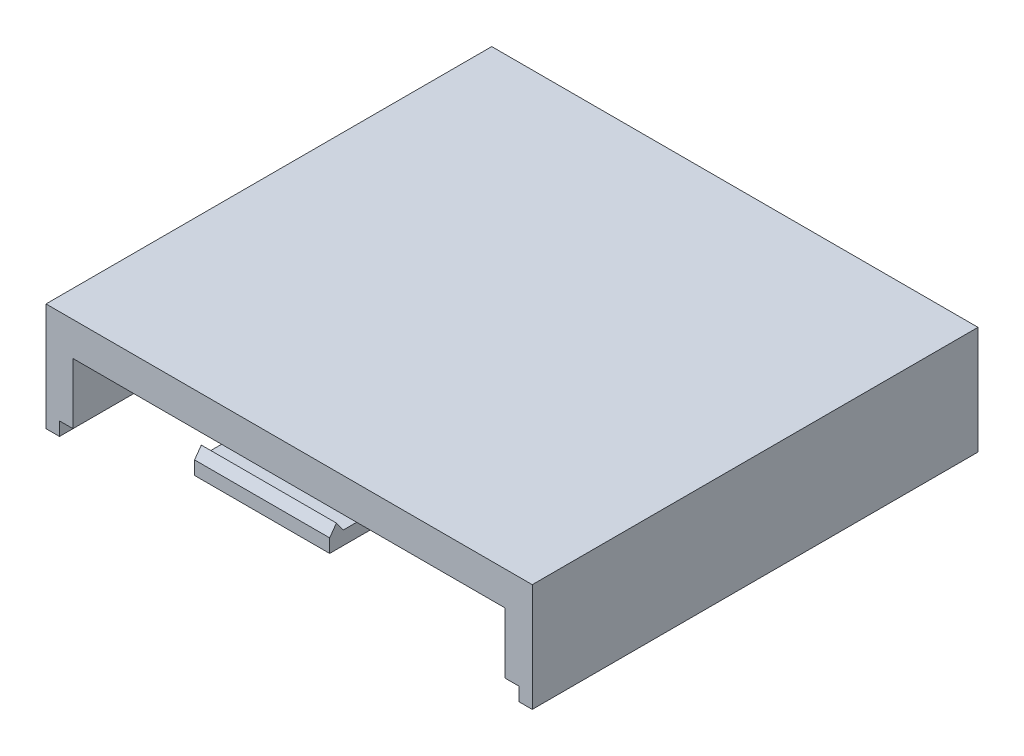
ISO-10303-21;
HEADER;
FILE_DESCRIPTION(('STEP AP214'),'2;1');
FILE_NAME('part.step','',(''),(''),'','','');
FILE_SCHEMA(('AUTOMOTIVE_DESIGN { 1 0 10303 214 1 1 1 1 }'));
ENDSEC;
DATA;
#1=APPLICATION_CONTEXT('core data for automotive mechanical design processes');
#2=APPLICATION_PROTOCOL_DEFINITION('international standard','automotive_design',2000,#1);
#3=PRODUCT_CONTEXT('',#1,'mechanical');
#4=PRODUCT('Part','Part','',(#3));
#5=PRODUCT_RELATED_PRODUCT_CATEGORY('part','',(#4));
#6=PRODUCT_DEFINITION_FORMATION('','',#4);
#7=PRODUCT_DEFINITION_CONTEXT('part definition',#1,'design');
#8=PRODUCT_DEFINITION('design','',#6,#7);
#9=PRODUCT_DEFINITION_SHAPE('','',#8);
#10=(LENGTH_UNIT() NAMED_UNIT(*) SI_UNIT(.MILLI.,.METRE.));
#11=(NAMED_UNIT(*) PLANE_ANGLE_UNIT() SI_UNIT($,.RADIAN.));
#12=(NAMED_UNIT(*) SI_UNIT($,.STERADIAN.) SOLID_ANGLE_UNIT());
#13=UNCERTAINTY_MEASURE_WITH_UNIT(LENGTH_MEASURE(1.E-05),#10,'distance_accuracy_value','');
#14=(GEOMETRIC_REPRESENTATION_CONTEXT(3) GLOBAL_UNCERTAINTY_ASSIGNED_CONTEXT((#13)) GLOBAL_UNIT_ASSIGNED_CONTEXT((#10,
#11,#12)) REPRESENTATION_CONTEXT('',''));
#15=CARTESIAN_POINT('',(0.,0.,0.));
#16=DIRECTION('',(0.,0.,1.));
#17=DIRECTION('',(1.,0.,0.));
#18=AXIS2_PLACEMENT_3D('',#15,#16,#17);
#19=CARTESIAN_POINT('',(17.,-5.50000000000001,33.));
#20=DIRECTION('',(0.,1.,0.));
#21=DIRECTION('',(0.,0.,1.));
#22=AXIS2_PLACEMENT_3D('',#19,#20,#21);
#23=PLANE('',#22);
#24=DIRECTION('',(0.,0.,-1.));
#25=VECTOR('',#24,1.);
#26=CARTESIAN_POINT('',(3.5,-5.50000000000001,1.2));
#27=LINE('',#26,#25);
#28=CARTESIAN_POINT('',(3.5,-5.50000000000001,1.2));
#29=VERTEX_POINT('',#28);
#30=CARTESIAN_POINT('',(3.5,-5.50000000000001,0.));
#31=VERTEX_POINT('',#30);
#32=EDGE_CURVE('E316',#29,#31,#27,.T.);
#33=ORIENTED_EDGE('',*,*,#32,.F.);
#34=DIRECTION('',(1.,0.,0.));
#35=VECTOR('',#34,1.);
#36=CARTESIAN_POINT('',(17.,-5.50000000000001,1.2));
#37=LINE('',#36,#35);
#38=CARTESIAN_POINT('',(-3.5,-5.50000000000001,1.2));
#39=VERTEX_POINT('',#38);
#40=EDGE_CURVE('E345',#39,#29,#37,.T.);
#41=ORIENTED_EDGE('',*,*,#40,.F.);
#42=DIRECTION('',(0.,0.,-1.));
#43=VECTOR('',#42,1.);
#44=CARTESIAN_POINT('',(-3.5,-5.50000000000001,1.2));
#45=LINE('',#44,#43);
#46=CARTESIAN_POINT('',(-3.5,-5.50000000000001,0.));
#47=VERTEX_POINT('',#46);
#48=EDGE_CURVE('E307',#39,#47,#45,.T.);
#49=ORIENTED_EDGE('',*,*,#48,.T.);
#50=DIRECTION('',(1.,0.,0.));
#51=VECTOR('',#50,1.);
#52=CARTESIAN_POINT('',(17.,-5.50000000000001,0.));
#53=LINE('',#52,#51);
#54=EDGE_CURVE('E383',#47,#31,#53,.T.);
#55=ORIENTED_EDGE('',*,*,#54,.T.);
#56=EDGE_LOOP('',(#33,#41,#49,#55));
#57=FACE_BOUND('',#56,.T.);
#58=ADVANCED_FACE('F33',(#57),#23,.F.);
#59=DIRECTION('',(0.,0.,-1.));
#60=VECTOR('',#59,1.);
#61=CARTESIAN_POINT('',(-5.,-5.50000000000001,1.2));
#62=LINE('',#61,#60);
#63=CARTESIAN_POINT('',(-5.,-5.50000000000001,1.2));
#64=VERTEX_POINT('',#63);
#65=CARTESIAN_POINT('',(-5.,-5.50000000000001,0.));
#66=VERTEX_POINT('',#65);
#67=EDGE_CURVE('E305',#64,#66,#62,.T.);
#68=ORIENTED_EDGE('',*,*,#67,.F.);
#69=CARTESIAN_POINT('',(-17.,-5.50000000000001,1.2));
#70=VERTEX_POINT('',#69);
#71=EDGE_CURVE('E341',#70,#64,#37,.T.);
#72=ORIENTED_EDGE('',*,*,#71,.F.);
#73=DIRECTION('',(0.,0.,-1.));
#74=VECTOR('',#73,1.);
#75=CARTESIAN_POINT('',(-17.,-5.50000000000001,33.));
#76=LINE('',#75,#74);
#77=CARTESIAN_POINT('',(-17.,-5.50000000000001,33.));
#78=VERTEX_POINT('',#77);
#79=EDGE_CURVE('E41',#78,#70,#76,.T.);
#80=ORIENTED_EDGE('',*,*,#79,.F.);
#81=DIRECTION('',(1.,0.,0.));
#82=VECTOR('',#81,1.);
#83=CARTESIAN_POINT('',(-18.,-5.50000000000001,33.));
#84=LINE('',#83,#82);
#85=CARTESIAN_POINT('',(-18.,-5.50000000000001,33.));
#86=VERTEX_POINT('',#85);
#87=EDGE_CURVE('E349',#86,#78,#84,.T.);
#88=ORIENTED_EDGE('',*,*,#87,.F.);
#89=DIRECTION('',(0.,0.,-1.));
#90=VECTOR('',#89,1.);
#91=CARTESIAN_POINT('',(-18.,-5.50000000000001,33.));
#92=LINE('',#91,#90);
#93=CARTESIAN_POINT('',(-18.,-5.50000000000001,0.));
#94=VERTEX_POINT('',#93);
#95=EDGE_CURVE('E11',#86,#94,#92,.T.);
#96=ORIENTED_EDGE('',*,*,#95,.T.);
#97=EDGE_CURVE('E379',#94,#66,#53,.T.);
#98=ORIENTED_EDGE('',*,*,#97,.T.);
#99=EDGE_LOOP('',(#68,#72,#80,#88,#96,#98));
#100=FACE_BOUND('',#99,.T.);
#101=ADVANCED_FACE('F424',(#100),#23,.F.);
#102=DIRECTION('',(0.,0.,-1.));
#103=VECTOR('',#102,1.);
#104=CARTESIAN_POINT('',(5.,-5.50000000000001,1.2));
#105=LINE('',#104,#103);
#106=CARTESIAN_POINT('',(5.,-5.50000000000001,1.2));
#107=VERTEX_POINT('',#106);
#108=CARTESIAN_POINT('',(5.,-5.50000000000001,0.));
#109=VERTEX_POINT('',#108);
#110=EDGE_CURVE('E56',#107,#109,#105,.T.);
#111=ORIENTED_EDGE('',*,*,#110,.T.);
#112=CARTESIAN_POINT('',(18.,-5.50000000000001,0.));
#113=VERTEX_POINT('',#112);
#114=EDGE_CURVE('E378',#109,#113,#53,.T.);
#115=ORIENTED_EDGE('',*,*,#114,.T.);
#116=DIRECTION('',(0.,0.,-1.));
#117=VECTOR('',#116,1.);
#118=CARTESIAN_POINT('',(18.,-5.50000000000001,33.));
#119=LINE('',#118,#117);
#120=CARTESIAN_POINT('',(18.,-5.50000000000001,33.));
#121=VERTEX_POINT('',#120);
#122=EDGE_CURVE('E391',#121,#113,#119,.T.);
#123=ORIENTED_EDGE('',*,*,#122,.F.);
#124=DIRECTION('',(1.,0.,0.));
#125=VECTOR('',#124,1.);
#126=CARTESIAN_POINT('',(17.,-5.50000000000001,33.));
#127=LINE('',#126,#125);
#128=CARTESIAN_POINT('',(17.,-5.50000000000001,33.));
#129=VERTEX_POINT('',#128);
#130=EDGE_CURVE('E369',#129,#121,#127,.T.);
#131=ORIENTED_EDGE('',*,*,#130,.F.);
#132=DIRECTION('',(0.,0.,-1.));
#133=VECTOR('',#132,1.);
#134=CARTESIAN_POINT('',(17.,-5.50000000000001,33.));
#135=LINE('',#134,#133);
#136=CARTESIAN_POINT('',(17.,-5.50000000000001,1.2));
#137=VERTEX_POINT('',#136);
#138=EDGE_CURVE('E394',#129,#137,#135,.T.);
#139=ORIENTED_EDGE('',*,*,#138,.T.);
#140=EDGE_CURVE('E340',#107,#137,#37,.T.);
#141=ORIENTED_EDGE('',*,*,#140,.F.);
#142=EDGE_LOOP('',(#111,#115,#123,#131,#139,#141));
#143=FACE_BOUND('',#142,.T.);
#144=ADVANCED_FACE('F443',(#143),#23,.F.);
#145=CARTESIAN_POINT('',(-17.,-5.50000000000001,33.));
#146=DIRECTION('',(-1.,0.,0.));
#147=DIRECTION('',(0.,0.,1.));
#148=AXIS2_PLACEMENT_3D('',#145,#146,#147);
#149=PLANE('',#148);
#150=DIRECTION('',(0.,-1.,0.));
#151=VECTOR('',#150,1.);
#152=CARTESIAN_POINT('',(-17.,-5.50000000000001,1.2));
#153=LINE('',#152,#151);
#154=CARTESIAN_POINT('',(-17.,-4.5,1.2));
#155=VERTEX_POINT('',#154);
#156=EDGE_CURVE('E337',#155,#70,#153,.T.);
#157=ORIENTED_EDGE('',*,*,#156,.F.);
#158=DIRECTION('',(0.,0.,-1.));
#159=VECTOR('',#158,1.);
#160=CARTESIAN_POINT('',(-17.,-4.5,33.));
#161=LINE('',#160,#159);
#162=CARTESIAN_POINT('',(-17.,-4.5,33.));
#163=VERTEX_POINT('',#162);
#164=EDGE_CURVE('E412',#163,#155,#161,.T.);
#165=ORIENTED_EDGE('',*,*,#164,.F.);
#166=DIRECTION('',(0.,1.,0.));
#167=VECTOR('',#166,1.);
#168=CARTESIAN_POINT('',(-17.,-5.50000000000001,33.));
#169=LINE('',#168,#167);
#170=EDGE_CURVE('E352',#78,#163,#169,.T.);
#171=ORIENTED_EDGE('',*,*,#170,.F.);
#172=ORIENTED_EDGE('',*,*,#79,.T.);
#173=EDGE_LOOP('',(#157,#165,#171,#172));
#174=FACE_BOUND('',#173,.T.);
#175=ADVANCED_FACE('F417',(#174),#149,.F.);
#176=CARTESIAN_POINT('',(-17.,-4.5,33.));
#177=DIRECTION('',(0.,1.,0.));
#178=DIRECTION('',(0.,0.,1.));
#179=AXIS2_PLACEMENT_3D('',#176,#177,#178);
#180=PLANE('',#179);
#181=DIRECTION('',(-1.,0.,0.));
#182=VECTOR('',#181,1.);
#183=CARTESIAN_POINT('',(-17.,-4.5,1.2));
#184=LINE('',#183,#182);
#185=CARTESIAN_POINT('',(-16.,-4.5,1.2));
#186=VERTEX_POINT('',#185);
#187=EDGE_CURVE('E334',#186,#155,#184,.T.);
#188=ORIENTED_EDGE('',*,*,#187,.F.);
#189=DIRECTION('',(0.,0.,-1.));
#190=VECTOR('',#189,1.);
#191=CARTESIAN_POINT('',(-16.,-4.5,33.));
#192=LINE('',#191,#190);
#193=CARTESIAN_POINT('',(-16.,-4.5,33.));
#194=VERTEX_POINT('',#193);
#195=EDGE_CURVE('E409',#194,#186,#192,.T.);
#196=ORIENTED_EDGE('',*,*,#195,.F.);
#197=DIRECTION('',(1.,0.,0.));
#198=VECTOR('',#197,1.);
#199=CARTESIAN_POINT('',(-17.,-4.5,33.));
#200=LINE('',#199,#198);
#201=EDGE_CURVE('E354',#163,#194,#200,.T.);
#202=ORIENTED_EDGE('',*,*,#201,.F.);
#203=ORIENTED_EDGE('',*,*,#164,.T.);
#204=EDGE_LOOP('',(#188,#196,#202,#203));
#205=FACE_BOUND('',#204,.T.);
#206=ADVANCED_FACE('F506',(#205),#180,.F.);
#207=CARTESIAN_POINT('',(-16.,-4.5,33.));
#208=DIRECTION('',(-1.,0.,0.));
#209=DIRECTION('',(0.,0.,1.));
#210=AXIS2_PLACEMENT_3D('',#207,#208,#209);
#211=PLANE('',#210);
#212=DIRECTION('',(0.,-1.,0.));
#213=VECTOR('',#212,1.);
#214=CARTESIAN_POINT('',(-16.,-4.5,1.2));
#215=LINE('',#214,#213);
#216=CARTESIAN_POINT('',(-16.,0.,1.2));
#217=VERTEX_POINT('',#216);
#218=EDGE_CURVE('E331',#217,#186,#215,.T.);
#219=ORIENTED_EDGE('',*,*,#218,.F.);
#220=DIRECTION('',(0.,0.,-1.));
#221=VECTOR('',#220,1.);
#222=CARTESIAN_POINT('',(-16.,0.,33.));
#223=LINE('',#222,#221);
#224=CARTESIAN_POINT('',(-16.,0.,33.));
#225=VERTEX_POINT('',#224);
#226=EDGE_CURVE('E406',#225,#217,#223,.T.);
#227=ORIENTED_EDGE('',*,*,#226,.F.);
#228=DIRECTION('',(0.,1.,0.));
#229=VECTOR('',#228,1.);
#230=CARTESIAN_POINT('',(-16.,-4.5,33.));
#231=LINE('',#230,#229);
#232=EDGE_CURVE('E356',#194,#225,#231,.T.);
#233=ORIENTED_EDGE('',*,*,#232,.F.);
#234=ORIENTED_EDGE('',*,*,#195,.T.);
#235=EDGE_LOOP('',(#219,#227,#233,#234));
#236=FACE_BOUND('',#235,.T.);
#237=ADVANCED_FACE('F501',(#236),#211,.F.);
#238=CARTESIAN_POINT('',(-16.,0.,33.));
#239=DIRECTION('',(0.,1.,0.));
#240=DIRECTION('',(-1.,0.,0.));
#241=AXIS2_PLACEMENT_3D('',#238,#239,#240);
#242=PLANE('',#241);
#243=DIRECTION('',(-1.,0.,0.));
#244=VECTOR('',#243,1.);
#245=CARTESIAN_POINT('',(-5.,0.,32.));
#246=LINE('',#245,#244);
#247=CARTESIAN_POINT('',(5.,0.,32.));
#248=VERTEX_POINT('',#247);
#249=CARTESIAN_POINT('',(-5.,0.,32.));
#250=VERTEX_POINT('',#249);
#251=EDGE_CURVE('E260',#248,#250,#246,.T.);
#252=ORIENTED_EDGE('',*,*,#251,.T.);
#253=DIRECTION('',(0.,0.,1.));
#254=VECTOR('',#253,1.);
#255=CARTESIAN_POINT('',(-5.,0.,32.));
#256=LINE('',#255,#254);
#257=CARTESIAN_POINT('',(-5.,0.,33.));
#258=VERTEX_POINT('',#257);
#259=EDGE_CURVE('E264',#250,#258,#256,.T.);
#260=ORIENTED_EDGE('',*,*,#259,.T.);
#261=DIRECTION('',(1.,0.,0.));
#262=VECTOR('',#261,1.);
#263=CARTESIAN_POINT('',(-16.,0.,33.));
#264=LINE('',#263,#262);
#265=EDGE_CURVE('E359',#225,#258,#264,.T.);
#266=ORIENTED_EDGE('',*,*,#265,.F.);
#267=ORIENTED_EDGE('',*,*,#226,.T.);
#268=DIRECTION('',(-1.,0.,0.));
#269=VECTOR('',#268,1.);
#270=CARTESIAN_POINT('',(-16.,0.,1.2));
#271=LINE('',#270,#269);
#272=CARTESIAN_POINT('',(16.,0.,1.2));
#273=VERTEX_POINT('',#272);
#274=EDGE_CURVE('E328',#273,#217,#271,.T.);
#275=ORIENTED_EDGE('',*,*,#274,.F.);
#276=DIRECTION('',(0.,0.,-1.));
#277=VECTOR('',#276,1.);
#278=CARTESIAN_POINT('',(16.,0.,33.));
#279=LINE('',#278,#277);
#280=CARTESIAN_POINT('',(16.,0.,33.));
#281=VERTEX_POINT('',#280);
#282=EDGE_CURVE('E403',#281,#273,#279,.T.);
#283=ORIENTED_EDGE('',*,*,#282,.F.);
#284=CARTESIAN_POINT('',(5.,0.,33.));
#285=VERTEX_POINT('',#284);
#286=EDGE_CURVE('E358',#285,#281,#264,.T.);
#287=ORIENTED_EDGE('',*,*,#286,.F.);
#288=DIRECTION('',(0.,0.,1.));
#289=VECTOR('',#288,1.);
#290=CARTESIAN_POINT('',(5.,0.,32.));
#291=LINE('',#290,#289);
#292=EDGE_CURVE('E48',#248,#285,#291,.T.);
#293=ORIENTED_EDGE('',*,*,#292,.F.);
#294=EDGE_LOOP('',(#252,#260,#266,#267,#275,#283,#287,#293));
#295=FACE_BOUND('',#294,.T.);
#296=ADVANCED_FACE('F496',(#295),#242,.F.);
#297=CARTESIAN_POINT('',(16.,0.,33.));
#298=DIRECTION('',(1.,0.,0.));
#299=DIRECTION('',(0.,1.,0.));
#300=AXIS2_PLACEMENT_3D('',#297,#298,#299);
#301=PLANE('',#300);
#302=DIRECTION('',(0.,1.,0.));
#303=VECTOR('',#302,1.);
#304=CARTESIAN_POINT('',(16.,0.,1.2));
#305=LINE('',#304,#303);
#306=CARTESIAN_POINT('',(16.,-4.5,1.2));
#307=VERTEX_POINT('',#306);
#308=EDGE_CURVE('E325',#307,#273,#305,.T.);
#309=ORIENTED_EDGE('',*,*,#308,.F.);
#310=DIRECTION('',(0.,0.,-1.));
#311=VECTOR('',#310,1.);
#312=CARTESIAN_POINT('',(16.,-4.5,33.));
#313=LINE('',#312,#311);
#314=CARTESIAN_POINT('',(16.,-4.5,33.));
#315=VERTEX_POINT('',#314);
#316=EDGE_CURVE('E400',#315,#307,#313,.T.);
#317=ORIENTED_EDGE('',*,*,#316,.F.);
#318=DIRECTION('',(0.,-1.,0.));
#319=VECTOR('',#318,1.);
#320=CARTESIAN_POINT('',(16.,0.,33.));
#321=LINE('',#320,#319);
#322=EDGE_CURVE('E362',#281,#315,#321,.T.);
#323=ORIENTED_EDGE('',*,*,#322,.F.);
#324=ORIENTED_EDGE('',*,*,#282,.T.);
#325=EDGE_LOOP('',(#309,#317,#323,#324));
#326=FACE_BOUND('',#325,.T.);
#327=ADVANCED_FACE('F492',(#326),#301,.F.);
#328=CARTESIAN_POINT('',(16.,-4.5,33.));
#329=DIRECTION('',(0.,1.,0.));
#330=DIRECTION('',(-1.,0.,0.));
#331=AXIS2_PLACEMENT_3D('',#328,#329,#330);
#332=PLANE('',#331);
#333=DIRECTION('',(-1.,0.,0.));
#334=VECTOR('',#333,1.);
#335=CARTESIAN_POINT('',(16.,-4.5,1.2));
#336=LINE('',#335,#334);
#337=CARTESIAN_POINT('',(17.,-4.5,1.2));
#338=VERTEX_POINT('',#337);
#339=EDGE_CURVE('E322',#338,#307,#336,.T.);
#340=ORIENTED_EDGE('',*,*,#339,.F.);
#341=DIRECTION('',(0.,0.,-1.));
#342=VECTOR('',#341,1.);
#343=CARTESIAN_POINT('',(17.,-4.5,33.));
#344=LINE('',#343,#342);
#345=CARTESIAN_POINT('',(17.,-4.5,33.));
#346=VERTEX_POINT('',#345);
#347=EDGE_CURVE('E397',#346,#338,#344,.T.);
#348=ORIENTED_EDGE('',*,*,#347,.F.);
#349=DIRECTION('',(1.,0.,0.));
#350=VECTOR('',#349,1.);
#351=CARTESIAN_POINT('',(16.,-4.5,33.));
#352=LINE('',#351,#350);
#353=EDGE_CURVE('E365',#315,#346,#352,.T.);
#354=ORIENTED_EDGE('',*,*,#353,.F.);
#355=ORIENTED_EDGE('',*,*,#316,.T.);
#356=EDGE_LOOP('',(#340,#348,#354,#355));
#357=FACE_BOUND('',#356,.T.);
#358=ADVANCED_FACE('F488',(#357),#332,.F.);
#359=CARTESIAN_POINT('',(17.,-4.5,33.));
#360=DIRECTION('',(1.,0.,0.));
#361=DIRECTION('',(0.,1.,0.));
#362=AXIS2_PLACEMENT_3D('',#359,#360,#361);
#363=PLANE('',#362);
#364=DIRECTION('',(0.,1.,0.));
#365=VECTOR('',#364,1.);
#366=CARTESIAN_POINT('',(17.,-4.5,1.2));
#367=LINE('',#366,#365);
#368=EDGE_CURVE('E319',#137,#338,#367,.T.);
#369=ORIENTED_EDGE('',*,*,#368,.F.);
#370=ORIENTED_EDGE('',*,*,#138,.F.);
#371=DIRECTION('',(0.,-1.,0.));
#372=VECTOR('',#371,1.);
#373=CARTESIAN_POINT('',(17.,-4.5,33.));
#374=LINE('',#373,#372);
#375=EDGE_CURVE('E367',#346,#129,#374,.T.);
#376=ORIENTED_EDGE('',*,*,#375,.F.);
#377=ORIENTED_EDGE('',*,*,#347,.T.);
#378=EDGE_LOOP('',(#369,#370,#376,#377));
#379=FACE_BOUND('',#378,.T.);
#380=ADVANCED_FACE('F486',(#379),#363,.F.);
#381=CARTESIAN_POINT('',(-18.,2.5,33.));
#382=DIRECTION('',(1.,0.,0.));
#383=DIRECTION('',(0.,0.,-1.));
#384=AXIS2_PLACEMENT_3D('',#381,#382,#383);
#385=PLANE('',#384);
#386=DIRECTION('',(0.,-1.,0.));
#387=VECTOR('',#386,1.);
#388=CARTESIAN_POINT('',(-18.,2.5,0.));
#389=LINE('',#388,#387);
#390=CARTESIAN_POINT('',(-18.,2.5,0.));
#391=VERTEX_POINT('',#390);
#392=EDGE_CURVE('E344',#391,#94,#389,.T.);
#393=ORIENTED_EDGE('',*,*,#392,.T.);
#394=ORIENTED_EDGE('',*,*,#95,.F.);
#395=DIRECTION('',(0.,-1.,0.));
#396=VECTOR('',#395,1.);
#397=CARTESIAN_POINT('',(-18.,2.5,33.));
#398=LINE('',#397,#396);
#399=CARTESIAN_POINT('',(-18.,2.5,33.));
#400=VERTEX_POINT('',#399);
#401=EDGE_CURVE('E346',#400,#86,#398,.T.);
#402=ORIENTED_EDGE('',*,*,#401,.F.);
#403=DIRECTION('',(0.,0.,-1.));
#404=VECTOR('',#403,1.);
#405=CARTESIAN_POINT('',(-18.,2.5,33.));
#406=LINE('',#405,#404);
#407=EDGE_CURVE('E375',#400,#391,#406,.T.);
#408=ORIENTED_EDGE('',*,*,#407,.T.);
#409=EDGE_LOOP('',(#393,#394,#402,#408));
#410=FACE_BOUND('',#409,.T.);
#411=ADVANCED_FACE('F35',(#410),#385,.F.);
#412=CARTESIAN_POINT('',(18.,-5.50000000000001,33.));
#413=DIRECTION('',(-1.,0.,0.));
#414=DIRECTION('',(0.,0.,1.));
#415=AXIS2_PLACEMENT_3D('',#412,#413,#414);
#416=PLANE('',#415);
#417=DIRECTION('',(0.,1.,0.));
#418=VECTOR('',#417,1.);
#419=CARTESIAN_POINT('',(18.,-5.50000000000001,0.));
#420=LINE('',#419,#418);
#421=CARTESIAN_POINT('',(18.,2.5,0.));
#422=VERTEX_POINT('',#421);
#423=EDGE_CURVE('E382',#113,#422,#420,.T.);
#424=ORIENTED_EDGE('',*,*,#423,.T.);
#425=DIRECTION('',(0.,0.,-1.));
#426=VECTOR('',#425,1.);
#427=CARTESIAN_POINT('',(18.,2.5,33.));
#428=LINE('',#427,#426);
#429=CARTESIAN_POINT('',(18.,2.5,33.));
#430=VERTEX_POINT('',#429);
#431=EDGE_CURVE('E388',#430,#422,#428,.T.);
#432=ORIENTED_EDGE('',*,*,#431,.F.);
#433=DIRECTION('',(0.,1.,0.));
#434=VECTOR('',#433,1.);
#435=CARTESIAN_POINT('',(18.,-5.50000000000001,33.));
#436=LINE('',#435,#434);
#437=EDGE_CURVE('E371',#121,#430,#436,.T.);
#438=ORIENTED_EDGE('',*,*,#437,.F.);
#439=ORIENTED_EDGE('',*,*,#122,.T.);
#440=EDGE_LOOP('',(#424,#432,#438,#439));
#441=FACE_BOUND('',#440,.T.);
#442=ADVANCED_FACE('F470',(#441),#416,.F.);
#443=CARTESIAN_POINT('',(18.,2.5,33.));
#444=DIRECTION('',(0.,-1.,0.));
#445=DIRECTION('',(0.,0.,-1.));
#446=AXIS2_PLACEMENT_3D('',#443,#444,#445);
#447=PLANE('',#446);
#448=DIRECTION('',(-1.,0.,0.));
#449=VECTOR('',#448,1.);
#450=CARTESIAN_POINT('',(18.,2.5,0.));
#451=LINE('',#450,#449);
#452=EDGE_CURVE('E350',#422,#391,#451,.T.);
#453=ORIENTED_EDGE('',*,*,#452,.T.);
#454=ORIENTED_EDGE('',*,*,#407,.F.);
#455=DIRECTION('',(-1.,0.,0.));
#456=VECTOR('',#455,1.);
#457=CARTESIAN_POINT('',(18.,2.5,33.));
#458=LINE('',#457,#456);
#459=EDGE_CURVE('E373',#430,#400,#458,.T.);
#460=ORIENTED_EDGE('',*,*,#459,.F.);
#461=ORIENTED_EDGE('',*,*,#431,.T.);
#462=EDGE_LOOP('',(#453,#454,#460,#461));
#463=FACE_BOUND('',#462,.T.);
#464=ADVANCED_FACE('F475',(#463),#447,.F.);
#465=CARTESIAN_POINT('',(0.,0.,33.));
#466=DIRECTION('',(0.,0.,1.));
#467=DIRECTION('',(1.,0.,0.));
#468=AXIS2_PLACEMENT_3D('',#465,#466,#467);
#469=PLANE('',#468);
#470=ORIENTED_EDGE('',*,*,#401,.T.);
#471=ORIENTED_EDGE('',*,*,#87,.T.);
#472=ORIENTED_EDGE('',*,*,#170,.T.);
#473=ORIENTED_EDGE('',*,*,#201,.T.);
#474=ORIENTED_EDGE('',*,*,#232,.T.);
#475=ORIENTED_EDGE('',*,*,#265,.T.);
#476=EDGE_CURVE('E363',#258,#285,#264,.T.);
#477=ORIENTED_EDGE('',*,*,#476,.T.);
#478=ORIENTED_EDGE('',*,*,#286,.T.);
#479=ORIENTED_EDGE('',*,*,#322,.T.);
#480=ORIENTED_EDGE('',*,*,#353,.T.);
#481=ORIENTED_EDGE('',*,*,#375,.T.);
#482=ORIENTED_EDGE('',*,*,#130,.T.);
#483=ORIENTED_EDGE('',*,*,#437,.T.);
#484=ORIENTED_EDGE('',*,*,#459,.T.);
#485=EDGE_LOOP('',(#470,#471,#472,#473,#474,#475,#477,#478,#479,#480,#481,#482,#483,#484));
#486=FACE_BOUND('',#485,.T.);
#487=ADVANCED_FACE('F481',(#486),#469,.T.);
#488=CARTESIAN_POINT('',(0.,0.,0.));
#489=DIRECTION('',(0.,0.,1.));
#490=DIRECTION('',(1.,0.,0.));
#491=AXIS2_PLACEMENT_3D('',#488,#489,#490);
#492=PLANE('',#491);
#493=DIRECTION('',(0.,-1.,0.));
#494=VECTOR('',#493,1.);
#495=CARTESIAN_POINT('',(3.5,-8.55000000000001,0.));
#496=LINE('',#495,#494);
#497=CARTESIAN_POINT('',(3.5,-8.55000000000001,0.));
#498=VERTEX_POINT('',#497);
#499=EDGE_CURVE('E267',#31,#498,#496,.T.);
#500=ORIENTED_EDGE('',*,*,#499,.F.);
#501=ORIENTED_EDGE('',*,*,#54,.F.);
#502=DIRECTION('',(0.,1.,0.));
#503=VECTOR('',#502,1.);
#504=CARTESIAN_POINT('',(-3.5,-5.50000000000001,0.));
#505=LINE('',#504,#503);
#506=CARTESIAN_POINT('',(-3.5,-8.55000000000001,0.));
#507=VERTEX_POINT('',#506);
#508=EDGE_CURVE('E291',#507,#47,#505,.T.);
#509=ORIENTED_EDGE('',*,*,#508,.F.);
#510=DIRECTION('',(-1.,0.,0.));
#511=VECTOR('',#510,1.);
#512=CARTESIAN_POINT('',(-3.5,-8.55000000000001,0.));
#513=LINE('',#512,#511);
#514=EDGE_CURVE('E289',#498,#507,#513,.T.);
#515=ORIENTED_EDGE('',*,*,#514,.F.);
#516=EDGE_LOOP('',(#500,#501,#509,#515));
#517=FACE_BOUND('',#516,.T.);
#518=ORIENTED_EDGE('',*,*,#97,.F.);
#519=ORIENTED_EDGE('',*,*,#392,.F.);
#520=ORIENTED_EDGE('',*,*,#452,.F.);
#521=ORIENTED_EDGE('',*,*,#423,.F.);
#522=ORIENTED_EDGE('',*,*,#114,.F.);
#523=DIRECTION('',(0.,1.,0.));
#524=VECTOR('',#523,1.);
#525=CARTESIAN_POINT('',(5.,-5.50000000000001,0.));
#526=LINE('',#525,#524);
#527=CARTESIAN_POINT('',(5.,-10.5,0.));
#528=VERTEX_POINT('',#527);
#529=EDGE_CURVE('E277',#528,#109,#526,.T.);
#530=ORIENTED_EDGE('',*,*,#529,.F.);
#531=DIRECTION('',(1.,0.,0.));
#532=VECTOR('',#531,1.);
#533=CARTESIAN_POINT('',(5.,-10.5,0.));
#534=LINE('',#533,#532);
#535=CARTESIAN_POINT('',(-5.,-10.5,0.));
#536=VERTEX_POINT('',#535);
#537=EDGE_CURVE('E295',#536,#528,#534,.T.);
#538=ORIENTED_EDGE('',*,*,#537,.F.);
#539=DIRECTION('',(0.,-1.,0.));
#540=VECTOR('',#539,1.);
#541=CARTESIAN_POINT('',(-5.,-10.5,0.));
#542=LINE('',#541,#540);
#543=EDGE_CURVE('E293',#66,#536,#542,.T.);
#544=ORIENTED_EDGE('',*,*,#543,.F.);
#545=EDGE_LOOP('',(#518,#519,#520,#521,#522,#530,#538,#544));
#546=FACE_BOUND('',#545,.T.);
#547=ADVANCED_FACE('F431',(#517,#546),#492,.F.);
#548=CARTESIAN_POINT('',(0.,0.,1.2));
#549=DIRECTION('',(0.,0.,-1.));
#550=DIRECTION('',(-1.,0.,0.));
#551=AXIS2_PLACEMENT_3D('',#548,#549,#550);
#552=PLANE('',#551);
#553=ORIENTED_EDGE('',*,*,#40,.T.);
#554=DIRECTION('',(0.,-1.,0.));
#555=VECTOR('',#554,1.);
#556=CARTESIAN_POINT('',(3.5,-8.55000000000001,1.2));
#557=LINE('',#556,#555);
#558=CARTESIAN_POINT('',(3.5,-8.55000000000001,1.2));
#559=VERTEX_POINT('',#558);
#560=EDGE_CURVE('E274',#29,#559,#557,.T.);
#561=ORIENTED_EDGE('',*,*,#560,.T.);
#562=DIRECTION('',(-1.,0.,0.));
#563=VECTOR('',#562,1.);
#564=CARTESIAN_POINT('',(-3.5,-8.55000000000001,1.2));
#565=LINE('',#564,#563);
#566=CARTESIAN_POINT('',(-3.5,-8.55000000000001,1.2));
#567=VERTEX_POINT('',#566);
#568=EDGE_CURVE('E276',#559,#567,#565,.T.);
#569=ORIENTED_EDGE('',*,*,#568,.T.);
#570=DIRECTION('',(0.,1.,0.));
#571=VECTOR('',#570,1.);
#572=CARTESIAN_POINT('',(-3.5,-5.50000000000001,1.2));
#573=LINE('',#572,#571);
#574=EDGE_CURVE('E279',#567,#39,#573,.T.);
#575=ORIENTED_EDGE('',*,*,#574,.T.);
#576=EDGE_LOOP('',(#553,#561,#569,#575));
#577=FACE_BOUND('',#576,.T.);
#578=ORIENTED_EDGE('',*,*,#368,.T.);
#579=ORIENTED_EDGE('',*,*,#339,.T.);
#580=ORIENTED_EDGE('',*,*,#308,.T.);
#581=ORIENTED_EDGE('',*,*,#274,.T.);
#582=ORIENTED_EDGE('',*,*,#218,.T.);
#583=ORIENTED_EDGE('',*,*,#187,.T.);
#584=ORIENTED_EDGE('',*,*,#156,.T.);
#585=ORIENTED_EDGE('',*,*,#71,.T.);
#586=DIRECTION('',(0.,-1.,0.));
#587=VECTOR('',#586,1.);
#588=CARTESIAN_POINT('',(-5.,-10.5,1.2));
#589=LINE('',#588,#587);
#590=CARTESIAN_POINT('',(-5.,-10.5,1.2));
#591=VERTEX_POINT('',#590);
#592=EDGE_CURVE('E282',#64,#591,#589,.T.);
#593=ORIENTED_EDGE('',*,*,#592,.T.);
#594=DIRECTION('',(1.,0.,0.));
#595=VECTOR('',#594,1.);
#596=CARTESIAN_POINT('',(5.,-10.5,1.2));
#597=LINE('',#596,#595);
#598=CARTESIAN_POINT('',(5.,-10.5,1.2));
#599=VERTEX_POINT('',#598);
#600=EDGE_CURVE('E284',#591,#599,#597,.T.);
#601=ORIENTED_EDGE('',*,*,#600,.T.);
#602=DIRECTION('',(0.,1.,0.));
#603=VECTOR('',#602,1.);
#604=CARTESIAN_POINT('',(5.,-5.50000000000001,1.2));
#605=LINE('',#604,#603);
#606=EDGE_CURVE('E286',#599,#107,#605,.T.);
#607=ORIENTED_EDGE('',*,*,#606,.T.);
#608=ORIENTED_EDGE('',*,*,#140,.T.);
#609=EDGE_LOOP('',(#578,#579,#580,#581,#582,#583,#584,#585,#593,#601,#607,#608));
#610=FACE_BOUND('',#609,.T.);
#611=ADVANCED_FACE('F422',(#577,#610),#552,.F.);
#612=CARTESIAN_POINT('',(3.5,-8.55000000000001,1.2));
#613=DIRECTION('',(1.,0.,0.));
#614=DIRECTION('',(0.,1.,0.));
#615=AXIS2_PLACEMENT_3D('',#612,#613,#614);
#616=PLANE('',#615);
#617=ORIENTED_EDGE('',*,*,#499,.T.);
#618=DIRECTION('',(0.,0.,-1.));
#619=VECTOR('',#618,1.);
#620=CARTESIAN_POINT('',(3.5,-8.55000000000001,1.2));
#621=LINE('',#620,#619);
#622=EDGE_CURVE('E313',#559,#498,#621,.T.);
#623=ORIENTED_EDGE('',*,*,#622,.F.);
#624=ORIENTED_EDGE('',*,*,#560,.F.);
#625=ORIENTED_EDGE('',*,*,#32,.T.);
#626=EDGE_LOOP('',(#617,#623,#624,#625));
#627=FACE_BOUND('',#626,.T.);
#628=ADVANCED_FACE('F456',(#627),#616,.F.);
#629=CARTESIAN_POINT('',(-3.5,-8.55000000000001,1.2));
#630=DIRECTION('',(0.,-1.,0.));
#631=DIRECTION('',(0.,0.,-1.));
#632=AXIS2_PLACEMENT_3D('',#629,#630,#631);
#633=PLANE('',#632);
#634=ORIENTED_EDGE('',*,*,#514,.T.);
#635=DIRECTION('',(0.,0.,-1.));
#636=VECTOR('',#635,1.);
#637=CARTESIAN_POINT('',(-3.5,-8.55000000000001,1.2));
#638=LINE('',#637,#636);
#639=EDGE_CURVE('E310',#567,#507,#638,.T.);
#640=ORIENTED_EDGE('',*,*,#639,.F.);
#641=ORIENTED_EDGE('',*,*,#568,.F.);
#642=ORIENTED_EDGE('',*,*,#622,.T.);
#643=EDGE_LOOP('',(#634,#640,#641,#642));
#644=FACE_BOUND('',#643,.T.);
#645=ADVANCED_FACE('F461',(#644),#633,.F.);
#646=CARTESIAN_POINT('',(-3.5,-5.50000000000001,1.2));
#647=DIRECTION('',(-1.,0.,0.));
#648=DIRECTION('',(0.,-1.,0.));
#649=AXIS2_PLACEMENT_3D('',#646,#647,#648);
#650=PLANE('',#649);
#651=ORIENTED_EDGE('',*,*,#508,.T.);
#652=ORIENTED_EDGE('',*,*,#48,.F.);
#653=ORIENTED_EDGE('',*,*,#574,.F.);
#654=ORIENTED_EDGE('',*,*,#639,.T.);
#655=EDGE_LOOP('',(#651,#652,#653,#654));
#656=FACE_BOUND('',#655,.T.);
#657=ADVANCED_FACE('F464',(#656),#650,.F.);
#658=CARTESIAN_POINT('',(-5.,-10.5,1.2));
#659=DIRECTION('',(1.,0.,0.));
#660=DIRECTION('',(0.,0.,-1.));
#661=AXIS2_PLACEMENT_3D('',#658,#659,#660);
#662=PLANE('',#661);
#663=ORIENTED_EDGE('',*,*,#543,.T.);
#664=DIRECTION('',(0.,0.,-1.));
#665=VECTOR('',#664,1.);
#666=CARTESIAN_POINT('',(-5.,-10.5,1.2));
#667=LINE('',#666,#665);
#668=EDGE_CURVE('E302',#591,#536,#667,.T.);
#669=ORIENTED_EDGE('',*,*,#668,.F.);
#670=ORIENTED_EDGE('',*,*,#592,.F.);
#671=ORIENTED_EDGE('',*,*,#67,.T.);
#672=EDGE_LOOP('',(#663,#669,#670,#671));
#673=FACE_BOUND('',#672,.T.);
#674=ADVANCED_FACE('F427',(#673),#662,.F.);
#675=CARTESIAN_POINT('',(5.,-10.5,1.2));
#676=DIRECTION('',(0.,1.,0.));
#677=DIRECTION('',(-1.,0.,0.));
#678=AXIS2_PLACEMENT_3D('',#675,#676,#677);
#679=PLANE('',#678);
#680=ORIENTED_EDGE('',*,*,#537,.T.);
#681=DIRECTION('',(0.,0.,-1.));
#682=VECTOR('',#681,1.);
#683=CARTESIAN_POINT('',(5.,-10.5,1.2));
#684=LINE('',#683,#682);
#685=EDGE_CURVE('E299',#599,#528,#684,.T.);
#686=ORIENTED_EDGE('',*,*,#685,.F.);
#687=ORIENTED_EDGE('',*,*,#600,.F.);
#688=ORIENTED_EDGE('',*,*,#668,.T.);
#689=EDGE_LOOP('',(#680,#686,#687,#688));
#690=FACE_BOUND('',#689,.T.);
#691=ADVANCED_FACE('F437',(#690),#679,.F.);
#692=CARTESIAN_POINT('',(5.,-5.50000000000001,1.2));
#693=DIRECTION('',(-1.,0.,0.));
#694=DIRECTION('',(0.,0.,1.));
#695=AXIS2_PLACEMENT_3D('',#692,#693,#694);
#696=PLANE('',#695);
#697=ORIENTED_EDGE('',*,*,#529,.T.);
#698=ORIENTED_EDGE('',*,*,#110,.F.);
#699=ORIENTED_EDGE('',*,*,#606,.F.);
#700=ORIENTED_EDGE('',*,*,#685,.T.);
#701=EDGE_LOOP('',(#697,#698,#699,#700));
#702=FACE_BOUND('',#701,.T.);
#703=ADVANCED_FACE('F439',(#702),#696,.F.);
#704=CARTESIAN_POINT('',(-5.,-1.,32.));
#705=DIRECTION('',(-1.,0.,0.));
#706=DIRECTION('',(0.,0.,1.));
#707=AXIS2_PLACEMENT_3D('',#704,#705,#706);
#708=PLANE('',#707);
#709=DIRECTION('',(0.,0.,1.));
#710=VECTOR('',#709,1.);
#711=CARTESIAN_POINT('',(-5.,-1.,32.));
#712=LINE('',#711,#710);
#713=CARTESIAN_POINT('',(-5.,-1.,32.));
#714=VERTEX_POINT('',#713);
#715=CARTESIAN_POINT('',(-5.,-1.,35.));
#716=VERTEX_POINT('',#715);
#717=EDGE_CURVE('E263',#714,#716,#712,.T.);
#718=ORIENTED_EDGE('',*,*,#717,.T.);
#719=DIRECTION('',(0.,-1.,0.));
#720=VECTOR('',#719,1.);
#721=CARTESIAN_POINT('',(-5.,-1.,35.));
#722=LINE('',#721,#720);
#723=CARTESIAN_POINT('',(-5.,0.,35.));
#724=VERTEX_POINT('',#723);
#725=EDGE_CURVE('E221',#724,#716,#722,.T.);
#726=ORIENTED_EDGE('',*,*,#725,.F.);
#727=DIRECTION('',(0.,-0.813733471206737,0.581238193719094));
#728=VECTOR('',#727,1.);
#729=CARTESIAN_POINT('',(-5.,0.,35.));
#730=LINE('',#729,#728);
#731=CARTESIAN_POINT('',(-5.,0.699999999999996,34.5));
#732=VERTEX_POINT('',#731);
#733=EDGE_CURVE('E213',#732,#724,#730,.T.);
#734=ORIENTED_EDGE('',*,*,#733,.F.);
#735=DIRECTION('',(0.,0.813733471206737,0.581238193719094));
#736=VECTOR('',#735,1.);
#737=CARTESIAN_POINT('',(-5.,0.699999999999995,34.5));
#738=LINE('',#737,#736);
#739=CARTESIAN_POINT('',(-5.,0.,34.));
#740=VERTEX_POINT('',#739);
#741=EDGE_CURVE('E218',#740,#732,#738,.T.);
#742=ORIENTED_EDGE('',*,*,#741,.F.);
#743=EDGE_CURVE('E268',#258,#740,#256,.T.);
#744=ORIENTED_EDGE('',*,*,#743,.F.);
#745=ORIENTED_EDGE('',*,*,#259,.F.);
#746=DIRECTION('',(0.,-1.,0.));
#747=VECTOR('',#746,1.);
#748=CARTESIAN_POINT('',(-5.,-1.,32.));
#749=LINE('',#748,#747);
#750=EDGE_CURVE('E252',#250,#714,#749,.T.);
#751=ORIENTED_EDGE('',*,*,#750,.T.);
#752=EDGE_LOOP('',(#718,#726,#734,#742,#744,#745,#751));
#753=FACE_BOUND('',#752,.T.);
#754=ADVANCED_FACE('F215',(#753),#708,.T.);
#755=CARTESIAN_POINT('',(-5.,0.,32.));
#756=DIRECTION('',(0.,1.,0.));
#757=DIRECTION('',(0.,0.,1.));
#758=AXIS2_PLACEMENT_3D('',#755,#756,#757);
#759=PLANE('',#758);
#760=DIRECTION('',(1.,0.,0.));
#761=VECTOR('',#760,1.);
#762=CARTESIAN_POINT('',(-6.22065556157337,0.,34.));
#763=LINE('',#762,#761);
#764=CARTESIAN_POINT('',(5.,0.,34.));
#765=VERTEX_POINT('',#764);
#766=EDGE_CURVE('E224',#740,#765,#763,.T.);
#767=ORIENTED_EDGE('',*,*,#766,.T.);
#768=EDGE_CURVE('E270',#285,#765,#291,.T.);
#769=ORIENTED_EDGE('',*,*,#768,.F.);
#770=ORIENTED_EDGE('',*,*,#476,.F.);
#771=ORIENTED_EDGE('',*,*,#743,.T.);
#772=EDGE_LOOP('',(#767,#769,#770,#771));
#773=FACE_BOUND('',#772,.T.);
#774=ADVANCED_FACE('F521',(#773),#759,.T.);
#775=CARTESIAN_POINT('',(5.,0.,32.));
#776=DIRECTION('',(1.,0.,0.));
#777=DIRECTION('',(0.,1.,0.));
#778=AXIS2_PLACEMENT_3D('',#775,#776,#777);
#779=PLANE('',#778);
#780=ORIENTED_EDGE('',*,*,#292,.T.);
#781=ORIENTED_EDGE('',*,*,#768,.T.);
#782=DIRECTION('',(0.,0.813733471206737,0.581238193719094));
#783=VECTOR('',#782,1.);
#784=CARTESIAN_POINT('',(5.,0.700000000000004,34.5));
#785=LINE('',#784,#783);
#786=CARTESIAN_POINT('',(5.,0.700000000000004,34.5));
#787=VERTEX_POINT('',#786);
#788=EDGE_CURVE('E238',#765,#787,#785,.T.);
#789=ORIENTED_EDGE('',*,*,#788,.T.);
#790=DIRECTION('',(0.,-0.813733471206737,0.581238193719094));
#791=VECTOR('',#790,1.);
#792=CARTESIAN_POINT('',(5.,0.,35.));
#793=LINE('',#792,#791);
#794=CARTESIAN_POINT('',(5.,0.,35.));
#795=VERTEX_POINT('',#794);
#796=EDGE_CURVE('E230',#787,#795,#793,.T.);
#797=ORIENTED_EDGE('',*,*,#796,.T.);
#798=DIRECTION('',(0.,1.,0.));
#799=VECTOR('',#798,1.);
#800=CARTESIAN_POINT('',(5.,0.,35.));
#801=LINE('',#800,#799);
#802=CARTESIAN_POINT('',(5.,-1.,35.));
#803=VERTEX_POINT('',#802);
#804=EDGE_CURVE('E247',#803,#795,#801,.T.);
#805=ORIENTED_EDGE('',*,*,#804,.F.);
#806=DIRECTION('',(0.,0.,1.));
#807=VECTOR('',#806,1.);
#808=CARTESIAN_POINT('',(5.,-1.,32.));
#809=LINE('',#808,#807);
#810=CARTESIAN_POINT('',(5.,-1.,32.));
#811=VERTEX_POINT('',#810);
#812=EDGE_CURVE('E271',#811,#803,#809,.T.);
#813=ORIENTED_EDGE('',*,*,#812,.F.);
#814=DIRECTION('',(0.,1.,0.));
#815=VECTOR('',#814,1.);
#816=CARTESIAN_POINT('',(5.,0.,32.));
#817=LINE('',#816,#815);
#818=EDGE_CURVE('E258',#811,#248,#817,.T.);
#819=ORIENTED_EDGE('',*,*,#818,.T.);
#820=EDGE_LOOP('',(#780,#781,#789,#797,#805,#813,#819));
#821=FACE_BOUND('',#820,.T.);
#822=ADVANCED_FACE('F519',(#821),#779,.T.);
#823=CARTESIAN_POINT('',(5.,-1.,32.));
#824=DIRECTION('',(0.,-1.,0.));
#825=DIRECTION('',(1.,0.,0.));
#826=AXIS2_PLACEMENT_3D('',#823,#824,#825);
#827=PLANE('',#826);
#828=ORIENTED_EDGE('',*,*,#812,.T.);
#829=DIRECTION('',(1.,0.,0.));
#830=VECTOR('',#829,1.);
#831=CARTESIAN_POINT('',(5.,-1.,35.));
#832=LINE('',#831,#830);
#833=EDGE_CURVE('E244',#716,#803,#832,.T.);
#834=ORIENTED_EDGE('',*,*,#833,.F.);
#835=ORIENTED_EDGE('',*,*,#717,.F.);
#836=DIRECTION('',(1.,0.,0.));
#837=VECTOR('',#836,1.);
#838=CARTESIAN_POINT('',(5.,-1.,32.));
#839=LINE('',#838,#837);
#840=EDGE_CURVE('E255',#714,#811,#839,.T.);
#841=ORIENTED_EDGE('',*,*,#840,.T.);
#842=EDGE_LOOP('',(#828,#834,#835,#841));
#843=FACE_BOUND('',#842,.T.);
#844=ADVANCED_FACE('F514',(#843),#827,.T.);
#845=CARTESIAN_POINT('',(0.,0.,32.));
#846=DIRECTION('',(0.,0.,-1.));
#847=DIRECTION('',(-1.,0.,0.));
#848=AXIS2_PLACEMENT_3D('',#845,#846,#847);
#849=PLANE('',#848);
#850=ORIENTED_EDGE('',*,*,#750,.F.);
#851=ORIENTED_EDGE('',*,*,#251,.F.);
#852=ORIENTED_EDGE('',*,*,#818,.F.);
#853=ORIENTED_EDGE('',*,*,#840,.F.);
#854=EDGE_LOOP('',(#850,#851,#852,#853));
#855=FACE_BOUND('',#854,.T.);
#856=ADVANCED_FACE('F511',(#855),#849,.T.);
#857=CARTESIAN_POINT('',(0.,0.,35.));
#858=DIRECTION('',(0.,0.,-1.));
#859=DIRECTION('',(-1.,0.,0.));
#860=AXIS2_PLACEMENT_3D('',#857,#858,#859);
#861=PLANE('',#860);
#862=ORIENTED_EDGE('',*,*,#725,.T.);
#863=ORIENTED_EDGE('',*,*,#833,.T.);
#864=ORIENTED_EDGE('',*,*,#804,.T.);
#865=DIRECTION('',(-1.,0.,0.));
#866=VECTOR('',#865,1.);
#867=CARTESIAN_POINT('',(-5.,0.,35.));
#868=LINE('',#867,#866);
#869=EDGE_CURVE('E250',#795,#724,#868,.T.);
#870=ORIENTED_EDGE('',*,*,#869,.T.);
#871=EDGE_LOOP('',(#862,#863,#864,#870));
#872=FACE_BOUND('',#871,.T.);
#873=ADVANCED_FACE('F518',(#872),#861,.F.);
#874=CARTESIAN_POINT('',(-6.22065556157338,0.699999999999995,34.5));
#875=DIRECTION('',(0.,0.581238193719094,-0.813733471206737));
#876=DIRECTION('',(0.,0.813733471206737,0.581238193719094));
#877=AXIS2_PLACEMENT_3D('',#874,#875,#876);
#878=PLANE('',#877);
#879=ORIENTED_EDGE('',*,*,#766,.F.);
#880=ORIENTED_EDGE('',*,*,#741,.T.);
#881=DIRECTION('',(1.,0.,0.));
#882=VECTOR('',#881,1.);
#883=CARTESIAN_POINT('',(-6.22065556157338,0.699999999999995,34.5));
#884=LINE('',#883,#882);
#885=EDGE_CURVE('E225',#732,#787,#884,.T.);
#886=ORIENTED_EDGE('',*,*,#885,.T.);
#887=ORIENTED_EDGE('',*,*,#788,.F.);
#888=EDGE_LOOP('',(#879,#880,#886,#887));
#889=FACE_BOUND('',#888,.T.);
#890=ADVANCED_FACE('F234',(#889),#878,.T.);
#891=CARTESIAN_POINT('',(-6.22065556157337,0.,35.));
#892=DIRECTION('',(0.,0.581238193719094,0.813733471206737));
#893=DIRECTION('',(0.,-0.813733471206737,0.581238193719094));
#894=AXIS2_PLACEMENT_3D('',#891,#892,#893);
#895=PLANE('',#894);
#896=ORIENTED_EDGE('',*,*,#885,.F.);
#897=ORIENTED_EDGE('',*,*,#733,.T.);
#898=ORIENTED_EDGE('',*,*,#869,.F.);
#899=ORIENTED_EDGE('',*,*,#796,.F.);
#900=EDGE_LOOP('',(#896,#897,#898,#899));
#901=FACE_BOUND('',#900,.T.);
#902=ADVANCED_FACE('F228',(#901),#895,.T.);
#903=CLOSED_SHELL('',(#58,#101,#144,#175,#206,#237,#296,#327,#358,#380,#411,#442,#464,#487,#547,
#611,#628,#645,#657,#674,#691,#703,#754,#774,#822,#844,#856,#873,#890,#902));
#904=MANIFOLD_SOLID_BREP('B2',#903);
#905=ADVANCED_BREP_SHAPE_REPRESENTATION('',(#18,#904),#14);
#906=SHAPE_DEFINITION_REPRESENTATION(#9,#905);
ENDSEC;
END-ISO-10303-21;
